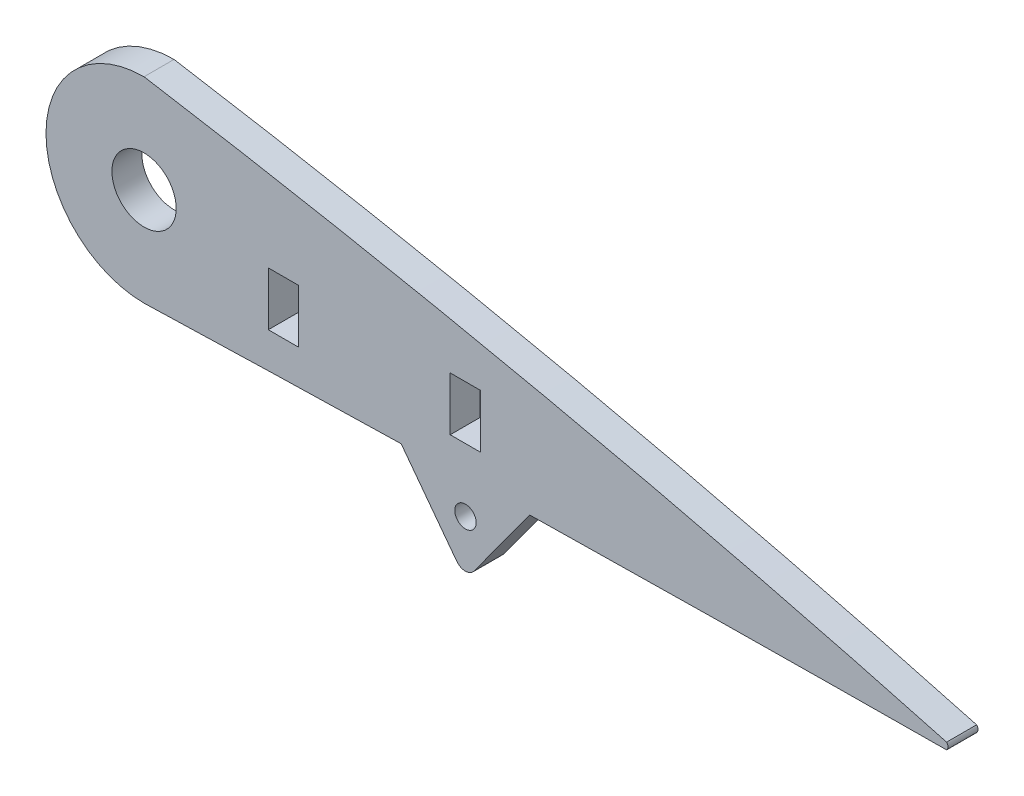
ISO-10303-21;
HEADER;
FILE_DESCRIPTION(('STEP AP214'),'2;1');
FILE_NAME('part.step','',(''),(''),'','','');
FILE_SCHEMA(('AUTOMOTIVE_DESIGN { 1 0 10303 214 1 1 1 1 }'));
ENDSEC;
DATA;
#1=APPLICATION_CONTEXT('core data for automotive mechanical design processes');
#2=APPLICATION_PROTOCOL_DEFINITION('international standard','automotive_design',2000,#1);
#3=PRODUCT_CONTEXT('',#1,'mechanical');
#4=PRODUCT('Part','Part','',(#3));
#5=PRODUCT_RELATED_PRODUCT_CATEGORY('part','',(#4));
#6=PRODUCT_DEFINITION_FORMATION('','',#4);
#7=PRODUCT_DEFINITION_CONTEXT('part definition',#1,'design');
#8=PRODUCT_DEFINITION('design','',#6,#7);
#9=PRODUCT_DEFINITION_SHAPE('','',#8);
#10=(LENGTH_UNIT() NAMED_UNIT(*) SI_UNIT(.MILLI.,.METRE.));
#11=(NAMED_UNIT(*) PLANE_ANGLE_UNIT() SI_UNIT($,.RADIAN.));
#12=(NAMED_UNIT(*) SI_UNIT($,.STERADIAN.) SOLID_ANGLE_UNIT());
#13=UNCERTAINTY_MEASURE_WITH_UNIT(LENGTH_MEASURE(1.E-05),#10,'distance_accuracy_value','');
#14=(GEOMETRIC_REPRESENTATION_CONTEXT(3) GLOBAL_UNCERTAINTY_ASSIGNED_CONTEXT((#13)) GLOBAL_UNIT_ASSIGNED_CONTEXT((#10,
#11,#12)) REPRESENTATION_CONTEXT('',''));
#15=CARTESIAN_POINT('',(0.,0.,0.));
#16=DIRECTION('',(0.,0.,1.));
#17=DIRECTION('',(1.,0.,0.));
#18=AXIS2_PLACEMENT_3D('',#15,#16,#17);
#19=CARTESIAN_POINT('',(138.143549961285,-100.777039100109,1.4));
#20=DIRECTION('',(-0.807875638847408,0.58935299452611,0.));
#21=DIRECTION('',(-0.58935299452611,-0.807875638847408,0.));
#22=AXIS2_PLACEMENT_3D('',#19,#20,#21);
#23=PLANE('',#22);
#24=DIRECTION('',(0.58935299452611,0.807875638847408,0.));
#25=VECTOR('',#24,1.);
#26=CARTESIAN_POINT('',(138.143549961285,-100.777039100109,-1.4));
#27=LINE('',#26,#25);
#28=CARTESIAN_POINT('',(205.887265796067,-7.91503921847947,-1.4));
#29=VERTEX_POINT('',#28);
#30=CARTESIAN_POINT('',(211.091334090503,-0.781385810383395,-1.4));
#31=VERTEX_POINT('',#30);
#32=EDGE_CURVE('E237',#29,#31,#27,.T.);
#33=ORIENTED_EDGE('',*,*,#32,.T.);
#34=DIRECTION('',(0.,0.,-1.));
#35=VECTOR('',#34,1.);
#36=CARTESIAN_POINT('',(211.091334090503,-0.781385810383395,1.4));
#37=LINE('',#36,#35);
#38=CARTESIAN_POINT('',(211.091334090503,-0.781385810383395,1.4));
#39=VERTEX_POINT('',#38);
#40=EDGE_CURVE('E11',#39,#31,#37,.T.);
#41=ORIENTED_EDGE('',*,*,#40,.F.);
#42=DIRECTION('',(0.58935299452611,0.807875638847408,0.));
#43=VECTOR('',#42,1.);
#44=CARTESIAN_POINT('',(138.143549961285,-100.777039100109,1.4));
#45=LINE('',#44,#43);
#46=CARTESIAN_POINT('',(205.887265796067,-7.91503921847947,1.4));
#47=VERTEX_POINT('',#46);
#48=EDGE_CURVE('E418',#47,#39,#45,.T.);
#49=ORIENTED_EDGE('',*,*,#48,.F.);
#50=DIRECTION('',(0.,0.,-1.));
#51=VECTOR('',#50,1.);
#52=CARTESIAN_POINT('',(205.887265796067,-7.91503921847947,1.4));
#53=LINE('',#52,#51);
#54=EDGE_CURVE('E279',#47,#29,#53,.T.);
#55=ORIENTED_EDGE('',*,*,#54,.T.);
#56=EDGE_LOOP('',(#33,#41,#49,#55));
#57=FACE_BOUND('',#56,.T.);
#58=ADVANCED_FACE('F41',(#57),#23,.F.);
#59=CARTESIAN_POINT('',(211.091334090503,-0.781385810385141,1.4));
#60=CARTESIAN_POINT('',(215.029550731743,-0.710611929763955,1.4));
#61=CARTESIAN_POINT('',(221.226120503685,-0.611852577215215,1.4));
#62=CARTESIAN_POINT('',(229.61763017219,-0.502926180051068,1.4));
#63=CARTESIAN_POINT('',(236.087353853958,-0.431514191746031,1.4));
#64=CARTESIAN_POINT('',(241.980776912645,-0.376520461471897,1.4));
#65=CARTESIAN_POINT('',(246.558970010783,-0.339535885925398,1.4));
#66=CARTESIAN_POINT('',(249.120490964528,-0.32127124245715,1.4));
#67=CARTESIAN_POINT('',(250.,-0.315,1.4));
#68=B_SPLINE_CURVE_WITH_KNOTS('',3,(#59,#60,#61,#62,#63,#64,#65,#66,#67),.UNSPECIFIED.,.F.,.F.,
(4,1,1,1,1,1,4),(0.846478182076588,0.893099151655267,0.919831064622048,0.945809917390178,
0.96968060086528,0.989589706283647,1.),.UNSPECIFIED.);
#69=DIRECTION('',(0.,0.,-1.));
#70=VECTOR('',#69,1.);
#71=SURFACE_OF_LINEAR_EXTRUSION('',#68,#70);
#72=CARTESIAN_POINT('',(211.091334090503,-0.781385810385141,-1.4));
#73=CARTESIAN_POINT('',(215.029550731743,-0.710611929763955,-1.4));
#74=CARTESIAN_POINT('',(221.226120503685,-0.611852577215215,-1.4));
#75=CARTESIAN_POINT('',(229.61763017219,-0.502926180051068,-1.4));
#76=CARTESIAN_POINT('',(236.087353853958,-0.431514191746031,-1.4));
#77=CARTESIAN_POINT('',(241.980776912645,-0.376520461471897,-1.4));
#78=CARTESIAN_POINT('',(246.558970010783,-0.339535885925398,-1.4));
#79=CARTESIAN_POINT('',(249.120490964528,-0.32127124245715,-1.4));
#80=CARTESIAN_POINT('',(250.,-0.315,-1.4));
#81=B_SPLINE_CURVE_WITH_KNOTS('',3,(#72,#73,#74,#75,#76,#77,#78,#79,#80),.UNSPECIFIED.,.F.,.F.,
(4,1,1,1,1,1,4),(0.846478182076588,0.893099151655267,0.919831064622048,0.945809917390178,
0.96968060086528,0.989589706283647,1.),.UNSPECIFIED.);
#82=CARTESIAN_POINT('',(250.,-0.315,-1.4));
#83=VERTEX_POINT('',#82);
#84=EDGE_CURVE('E241',#31,#83,#81,.T.);
#85=ORIENTED_EDGE('',*,*,#84,.T.);
#86=DIRECTION('',(0.,0.,-1.));
#87=VECTOR('',#86,1.);
#88=CARTESIAN_POINT('',(250.,-0.315,1.4));
#89=LINE('',#88,#87);
#90=CARTESIAN_POINT('',(250.,-0.315,1.4));
#91=VERTEX_POINT('',#90);
#92=EDGE_CURVE('E52',#91,#83,#89,.T.);
#93=ORIENTED_EDGE('',*,*,#92,.F.);
#94=EDGE_CURVE('E420',#39,#91,#68,.T.);
#95=ORIENTED_EDGE('',*,*,#94,.F.);
#96=ORIENTED_EDGE('',*,*,#40,.T.);
#97=EDGE_LOOP('',(#85,#93,#95,#96));
#98=FACE_BOUND('',#97,.T.);
#99=ADVANCED_FACE('F345',(#98),#71,.F.);
#100=CARTESIAN_POINT('',(249.685,0.,1.4));
#101=DIRECTION('',(0.,0.,-1.));
#102=DIRECTION('',(-1.,0.,0.));
#103=AXIS2_PLACEMENT_3D('',#100,#101,#102);
#104=CYLINDRICAL_SURFACE('',#103,0.445477272147512);
#105=CARTESIAN_POINT('',(249.685,0.,-1.4));
#106=DIRECTION('',(0.,0.,1.));
#107=DIRECTION('',(1.,0.,0.));
#108=AXIS2_PLACEMENT_3D('',#105,#106,#107);
#109=CIRCLE('',#108,0.445477272147512);
#110=CARTESIAN_POINT('',(250.,0.315,-1.4));
#111=VERTEX_POINT('',#110);
#112=EDGE_CURVE('E247',#111,#83,#109,.F.);
#113=ORIENTED_EDGE('',*,*,#112,.F.);
#114=DIRECTION('',(0.,0.,-1.));
#115=VECTOR('',#114,1.);
#116=CARTESIAN_POINT('',(250.,0.315,1.4));
#117=LINE('',#116,#115);
#118=CARTESIAN_POINT('',(250.,0.315,1.4));
#119=VERTEX_POINT('',#118);
#120=EDGE_CURVE('E290',#119,#111,#117,.T.);
#121=ORIENTED_EDGE('',*,*,#120,.F.);
#122=CARTESIAN_POINT('',(249.685,0.,1.4));
#123=DIRECTION('',(0.,0.,1.));
#124=DIRECTION('',(1.,0.,0.));
#125=AXIS2_PLACEMENT_3D('',#122,#123,#124);
#126=CIRCLE('',#125,0.445477272147512);
#127=EDGE_CURVE('E406',#119,#91,#126,.F.);
#128=ORIENTED_EDGE('',*,*,#127,.T.);
#129=ORIENTED_EDGE('',*,*,#92,.T.);
#130=EDGE_LOOP('',(#113,#121,#128,#129));
#131=FACE_BOUND('',#130,.T.);
#132=ADVANCED_FACE('F351',(#131),#104,.T.);
#133=CARTESIAN_POINT('',(250.,0.315,1.4));
#134=CARTESIAN_POINT('',(249.1556677398,0.545019817836279,1.4));
#135=CARTESIAN_POINT('',(246.72017569763,1.20851624251313,1.4));
#136=CARTESIAN_POINT('',(242.39133208333,2.35833905261626,1.4));
#137=CARTESIAN_POINT('',(236.8497612043,3.78762536446423,1.4));
#138=CARTESIAN_POINT('',(230.779918279366,5.29800883725429,1.4));
#139=CARTESIAN_POINT('',(224.455917947462,6.81286602762795,1.4));
#140=CARTESIAN_POINT('',(218.030543495663,8.2916106324586,1.4));
#141=CARTESIAN_POINT('',(211.562405044606,9.71973505661334,1.4));
#142=CARTESIAN_POINT('',(205.072411508973,11.0923749324442,1.4));
#143=CARTESIAN_POINT('',(198.567970912658,12.4078507263971,1.4));
#144=CARTESIAN_POINT('',(192.05236991352,13.6652979238497,1.4));
#145=CARTESIAN_POINT('',(185.527619972818,14.8640933031022,1.4));
#146=CARTESIAN_POINT('',(178.995338991115,16.0034047787228,1.4));
#147=CARTESIAN_POINT('',(172.457064741278,17.0823881152075,1.4));
#148=CARTESIAN_POINT('',(165.914317094847,18.0998278411168,1.4));
#149=CARTESIAN_POINT('',(159.368680729007,19.0545018148018,1.4));
#150=CARTESIAN_POINT('',(152.821805127969,19.9448856028229,1.4));
#151=CARTESIAN_POINT('',(146.275439401362,20.76928218283,1.4));
#152=CARTESIAN_POINT('',(139.731359791294,21.5256761133202,1.4));
#153=CARTESIAN_POINT('',(133.191836730309,22.2120042488889,1.4));
#154=CARTESIAN_POINT('',(126.658683026114,22.8257214286805,1.4));
#155=CARTESIAN_POINT('',(120.136770918309,23.363973266088,1.4));
#156=CARTESIAN_POINT('',(113.628567140501,23.8246773240715,1.4));
#157=CARTESIAN_POINT('',(107.152732037453,24.2002425936989,1.4));
#158=CARTESIAN_POINT('',(100.741095692949,24.4983995100481,1.4));
#159=CARTESIAN_POINT('',(94.4117527148801,24.6866497684384,1.4));
#160=CARTESIAN_POINT('',(88.1559179929208,24.7400956502598,1.4));
#161=CARTESIAN_POINT('',(81.9490430552625,24.658849143563,1.4));
#162=CARTESIAN_POINT('',(75.7805205915729,24.4410138083138,1.4));
#163=CARTESIAN_POINT('',(69.653692942001,24.0818848206021,1.4));
#164=CARTESIAN_POINT('',(63.5754105017725,23.5780063609574,1.4));
#165=CARTESIAN_POINT('',(57.5551895509689,22.9249466580897,1.4));
#166=CARTESIAN_POINT('',(51.6057626883655,22.1190655216041,1.4));
#167=CARTESIAN_POINT('',(45.7444003114454,21.1565644320825,1.4));
#168=CARTESIAN_POINT('',(39.9958575941734,20.035371389506,1.4));
#169=CARTESIAN_POINT('',(34.397919842374,18.756316234168,1.4));
#170=CARTESIAN_POINT('',(29.0103821035244,17.327615607561,1.4));
#171=CARTESIAN_POINT('',(23.9257984082512,15.7718649214876,1.4));
#172=CARTESIAN_POINT('',(19.2706788398757,14.1342694339559,1.4));
#173=CARTESIAN_POINT('',(15.1790983912921,12.4833354375465,1.4));
#174=CARTESIAN_POINT('',(11.7404757900967,10.8956109948061,1.4));
#175=CARTESIAN_POINT('',(8.95937186897629,9.42957736532332,1.4));
#176=CARTESIAN_POINT('',(6.76089118010329,8.10860319940964,1.4));
#177=CARTESIAN_POINT('',(5.03370974806799,6.92463805475642,1.4));
#178=CARTESIAN_POINT('',(3.67169493343308,5.85422966432144,1.4));
#179=CARTESIAN_POINT('',(2.59210112319415,4.87130536863603,1.4));
#180=CARTESIAN_POINT('',(1.73817566850273,3.95259574329487,1.4));
#181=CARTESIAN_POINT('',(1.06987082981603,3.08094637334676,1.4));
#182=CARTESIAN_POINT('',(0.571645410381898,2.24162210227498,1.4));
#183=CARTESIAN_POINT('',(0.215773898828885,1.43078539700941,1.4));
#184=CARTESIAN_POINT('',(0.102255581551055,0.88324169451159,1.4));
#185=CARTESIAN_POINT('',(0.047975,0.621425,1.4));
#186=B_SPLINE_CURVE_WITH_KNOTS('',3,(#133,#134,#135,#136,#137,#138,#139,#140,#141,#142,#143,
#144,#145,#146,#147,#148,#149,#150,#151,#152,#153,#154,#155,#156,#157,#158,#159,#160,#161,#162,
#163,#164,#165,#166,#167,#168,#169,#170,#171,#172,#173,#174,#175,#176,#177,#178,#179,#180,#181,
#182,#183,#184,#185),.UNSPECIFIED.,.F.,.F.,(4,1,1,1,1,1,1,1,1,1,1,1,1,1,1,1,1,1,1,1,1,1,1,1,1,1,
1,1,1,1,1,1,1,1,1,1,1,1,1,1,1,1,1,1,1,1,1,1,1,1,4),(0.,0.0101621996718152,0.029313053164405,
0.0520116049167946,0.0766194676467142,0.101948061207292,0.127526131749972,0.153184130655642,
0.178867887696566,0.204557902716051,0.230245711588722,0.255925967287604,0.281594302232909,
0.307246419826604,0.332878041533464,0.358484538095463,0.384061185999046,0.409602822472883,
0.435103874040524,0.460559416336008,0.485959195382529,0.511303069995141,0.53655151535457,
0.561723365940153,0.586628866723787,0.611085431247163,0.63525120042125,0.659272175841394,
0.683163753229342,0.706922144180534,0.730535909866309,0.753983199646257,0.777234690063445,
0.800246382303428,0.822950708941546,0.845237155368769,0.866915895838024,0.887662334604257,
0.906968280539555,0.924203157053238,0.938878974509372,0.95093161065299,0.960693484285195,
0.968646729467272,0.975232933115936,0.980794743901537,0.985583761312909,0.989781538836832,
0.99352131251264,0.996902112954681,1.),.UNSPECIFIED.);
#187=DIRECTION('',(0.,0.,-1.));
#188=VECTOR('',#187,1.);
#189=SURFACE_OF_LINEAR_EXTRUSION('',#186,#188);
#190=CARTESIAN_POINT('',(250.,0.315,-1.4));
#191=CARTESIAN_POINT('',(249.1556677398,0.545019817836279,-1.4));
#192=CARTESIAN_POINT('',(246.72017569763,1.20851624251313,-1.4));
#193=CARTESIAN_POINT('',(242.39133208333,2.35833905261626,-1.4));
#194=CARTESIAN_POINT('',(236.8497612043,3.78762536446423,-1.4));
#195=CARTESIAN_POINT('',(230.779918279366,5.29800883725429,-1.4));
#196=CARTESIAN_POINT('',(224.455917947462,6.81286602762795,-1.4));
#197=CARTESIAN_POINT('',(218.030543495663,8.2916106324586,-1.4));
#198=CARTESIAN_POINT('',(211.562405044606,9.71973505661334,-1.4));
#199=CARTESIAN_POINT('',(205.072411508973,11.0923749324442,-1.4));
#200=CARTESIAN_POINT('',(198.567970912658,12.4078507263971,-1.4));
#201=CARTESIAN_POINT('',(192.05236991352,13.6652979238497,-1.4));
#202=CARTESIAN_POINT('',(185.527619972818,14.8640933031022,-1.4));
#203=CARTESIAN_POINT('',(178.995338991115,16.0034047787228,-1.4));
#204=CARTESIAN_POINT('',(172.457064741278,17.0823881152075,-1.4));
#205=CARTESIAN_POINT('',(165.914317094847,18.0998278411168,-1.4));
#206=CARTESIAN_POINT('',(159.368680729007,19.0545018148018,-1.4));
#207=CARTESIAN_POINT('',(152.821805127969,19.9448856028229,-1.4));
#208=CARTESIAN_POINT('',(146.275439401362,20.76928218283,-1.4));
#209=CARTESIAN_POINT('',(139.731359791294,21.5256761133202,-1.4));
#210=CARTESIAN_POINT('',(133.191836730309,22.2120042488889,-1.4));
#211=CARTESIAN_POINT('',(126.658683026114,22.8257214286805,-1.4));
#212=CARTESIAN_POINT('',(120.136770918309,23.363973266088,-1.4));
#213=CARTESIAN_POINT('',(113.628567140501,23.8246773240715,-1.4));
#214=CARTESIAN_POINT('',(107.152732037453,24.2002425936989,-1.4));
#215=CARTESIAN_POINT('',(100.741095692949,24.4983995100481,-1.4));
#216=CARTESIAN_POINT('',(94.4117527148801,24.6866497684384,-1.4));
#217=CARTESIAN_POINT('',(88.1559179929208,24.7400956502598,-1.4));
#218=CARTESIAN_POINT('',(81.9490430552625,24.658849143563,-1.4));
#219=CARTESIAN_POINT('',(75.7805205915729,24.4410138083138,-1.4));
#220=CARTESIAN_POINT('',(69.653692942001,24.0818848206021,-1.4));
#221=CARTESIAN_POINT('',(63.5754105017725,23.5780063609574,-1.4));
#222=CARTESIAN_POINT('',(57.5551895509689,22.9249466580897,-1.4));
#223=CARTESIAN_POINT('',(51.6057626883655,22.1190655216041,-1.4));
#224=CARTESIAN_POINT('',(45.7444003114454,21.1565644320825,-1.4));
#225=CARTESIAN_POINT('',(39.9958575941734,20.035371389506,-1.4));
#226=CARTESIAN_POINT('',(34.397919842374,18.756316234168,-1.4));
#227=CARTESIAN_POINT('',(29.0103821035244,17.327615607561,-1.4));
#228=CARTESIAN_POINT('',(23.9257984082512,15.7718649214876,-1.4));
#229=CARTESIAN_POINT('',(19.2706788398757,14.1342694339559,-1.4));
#230=CARTESIAN_POINT('',(15.1790983912921,12.4833354375465,-1.4));
#231=CARTESIAN_POINT('',(11.7404757900967,10.8956109948061,-1.4));
#232=CARTESIAN_POINT('',(8.95937186897629,9.42957736532332,-1.4));
#233=CARTESIAN_POINT('',(6.76089118010329,8.10860319940964,-1.4));
#234=CARTESIAN_POINT('',(5.03370974806799,6.92463805475642,-1.4));
#235=CARTESIAN_POINT('',(3.67169493343308,5.85422966432144,-1.4));
#236=CARTESIAN_POINT('',(2.59210112319415,4.87130536863603,-1.4));
#237=CARTESIAN_POINT('',(1.73817566850273,3.95259574329487,-1.4));
#238=CARTESIAN_POINT('',(1.06987082981603,3.08094637334676,-1.4));
#239=CARTESIAN_POINT('',(0.571645410381898,2.24162210227498,-1.4));
#240=CARTESIAN_POINT('',(0.215773898828885,1.43078539700941,-1.4));
#241=CARTESIAN_POINT('',(0.102255581551055,0.88324169451159,-1.4));
#242=CARTESIAN_POINT('',(0.047975,0.621425,-1.4));
#243=B_SPLINE_CURVE_WITH_KNOTS('',3,(#190,#191,#192,#193,#194,#195,#196,#197,#198,#199,#200,
#201,#202,#203,#204,#205,#206,#207,#208,#209,#210,#211,#212,#213,#214,#215,#216,#217,#218,#219,
#220,#221,#222,#223,#224,#225,#226,#227,#228,#229,#230,#231,#232,#233,#234,#235,#236,#237,#238,
#239,#240,#241,#242),.UNSPECIFIED.,.F.,.F.,(4,1,1,1,1,1,1,1,1,1,1,1,1,1,1,1,1,1,1,1,1,1,1,1,1,1,
1,1,1,1,1,1,1,1,1,1,1,1,1,1,1,1,1,1,1,1,1,1,1,1,4),(0.,0.0101621996718152,0.029313053164405,
0.0520116049167946,0.0766194676467142,0.101948061207292,0.127526131749972,0.153184130655642,
0.178867887696566,0.204557902716051,0.230245711588722,0.255925967287604,0.281594302232909,
0.307246419826604,0.332878041533464,0.358484538095463,0.384061185999046,0.409602822472883,
0.435103874040524,0.460559416336008,0.485959195382529,0.511303069995141,0.53655151535457,
0.561723365940153,0.586628866723787,0.611085431247163,0.63525120042125,0.659272175841394,
0.683163753229342,0.706922144180534,0.730535909866309,0.753983199646257,0.777234690063445,
0.800246382303428,0.822950708941546,0.845237155368769,0.866915895838024,0.887662334604257,
0.906968280539555,0.924203157053238,0.938878974509372,0.95093161065299,0.960693484285195,
0.968646729467272,0.975232933115936,0.980794743901537,0.985583761312909,0.989781538836832,
0.99352131251264,0.996902112954681,1.),.UNSPECIFIED.);
#244=CARTESIAN_POINT('',(175.091334090503,16.6447875148628,-1.4));
#245=VERTEX_POINT('',#244);
#246=EDGE_CURVE('E254',#111,#245,#243,.T.);
#247=ORIENTED_EDGE('',*,*,#246,.T.);
#248=DIRECTION('',(0.,0.,-1.));
#249=VECTOR('',#248,1.);
#250=CARTESIAN_POINT('',(175.091334090503,16.6447875148628,1.4));
#251=LINE('',#250,#249);
#252=CARTESIAN_POINT('',(175.091334090503,16.6447875148628,1.4));
#253=VERTEX_POINT('',#252);
#254=EDGE_CURVE('E287',#253,#245,#251,.T.);
#255=ORIENTED_EDGE('',*,*,#254,.F.);
#256=EDGE_CURVE('E400',#119,#253,#186,.T.);
#257=ORIENTED_EDGE('',*,*,#256,.F.);
#258=ORIENTED_EDGE('',*,*,#120,.T.);
#259=EDGE_LOOP('',(#247,#255,#257,#258));
#260=FACE_BOUND('',#259,.T.);
#261=ADVANCED_FACE('F395',(#260),#189,.F.);
#262=CARTESIAN_POINT('',(175.091334090503,7.49391035659057,1.4));
#263=DIRECTION('',(0.,0.,-1.));
#264=DIRECTION('',(-1.,0.,0.));
#265=AXIS2_PLACEMENT_3D('',#262,#263,#264);
#266=CYLINDRICAL_SURFACE('',#265,9.15087715827226);
#267=CARTESIAN_POINT('',(175.091334090503,7.49391035659057,-1.4));
#268=DIRECTION('',(0.,0.,1.));
#269=DIRECTION('',(1.,0.,0.));
#270=AXIS2_PLACEMENT_3D('',#267,#268,#269);
#271=CIRCLE('',#270,9.15087715827226);
#272=CARTESIAN_POINT('',(175.091334090503,-1.65696680168169,-1.4));
#273=VERTEX_POINT('',#272);
#274=EDGE_CURVE('E260',#273,#245,#271,.F.);
#275=ORIENTED_EDGE('',*,*,#274,.F.);
#276=DIRECTION('',(0.,0.,-1.));
#277=VECTOR('',#276,1.);
#278=CARTESIAN_POINT('',(175.091334090503,-1.65696680168169,1.4));
#279=LINE('',#278,#277);
#280=CARTESIAN_POINT('',(175.091334090503,-1.65696680168169,1.4));
#281=VERTEX_POINT('',#280);
#282=EDGE_CURVE('E183',#281,#273,#279,.T.);
#283=ORIENTED_EDGE('',*,*,#282,.F.);
#284=CARTESIAN_POINT('',(175.091334090503,7.49391035659057,1.4));
#285=DIRECTION('',(0.,0.,1.));
#286=DIRECTION('',(1.,0.,0.));
#287=AXIS2_PLACEMENT_3D('',#284,#285,#286);
#288=CIRCLE('',#287,9.15087715827226);
#289=EDGE_CURVE('E174',#281,#253,#288,.F.);
#290=ORIENTED_EDGE('',*,*,#289,.T.);
#291=ORIENTED_EDGE('',*,*,#254,.T.);
#292=EDGE_LOOP('',(#275,#283,#290,#291));
#293=FACE_BOUND('',#292,.T.);
#294=ADVANCED_FACE('F392',(#293),#266,.T.);
#295=CARTESIAN_POINT('',(0.0479750000000421,0.621425,1.4));
#296=CARTESIAN_POINT('',(0.022713820327741,0.373490085622781,1.4));
#297=CARTESIAN_POINT('',(-0.0278207890064172,-0.122499975050795,1.4));
#298=CARTESIAN_POINT('',(0.0779912124031796,-0.88443459016519,1.4));
#299=CARTESIAN_POINT('',(0.349695650480458,-1.63883807038265,1.4));
#300=CARTESIAN_POINT('',(0.814331135147463,-2.36506892355342,1.4));
#301=CARTESIAN_POINT('',(1.4634807804219,-3.03927524464575,1.4));
#302=CARTESIAN_POINT('',(2.29097301669102,-3.66099946963281,1.4));
#303=CARTESIAN_POINT('',(3.30592875031195,-4.2357796210425,1.4));
#304=CARTESIAN_POINT('',(4.53525561919671,-4.77367414359715,1.4));
#305=CARTESIAN_POINT('',(6.02974568831346,-5.28219216458874,1.4));
#306=CARTESIAN_POINT('',(7.86898121529209,-5.76531667645051,1.4));
#307=CARTESIAN_POINT('',(10.1688313918681,-6.22171659287992,1.4));
#308=CARTESIAN_POINT('',(13.0754381889024,-6.63961873115047,1.4));
#309=CARTESIAN_POINT('',(16.7281153626735,-6.99295673763017,1.4));
#310=CARTESIAN_POINT('',(21.1899520960732,-7.24734514464806,1.4));
#311=CARTESIAN_POINT('',(26.3999844156187,-7.37663884891169,1.4));
#312=CARTESIAN_POINT('',(32.1973985639445,-7.37625691302859,1.4));
#313=CARTESIAN_POINT('',(38.3978067590692,-7.26143657975343,1.4));
#314=CARTESIAN_POINT('',(44.8576217679812,-7.05664135811482,1.4));
#315=CARTESIAN_POINT('',(51.4865430961522,-6.78645353185094,1.4));
#316=CARTESIAN_POINT('',(58.2309809321379,-6.472324586792,1.4));
#317=CARTESIAN_POINT('',(65.0520946060157,-6.13285226452229,1.4));
#318=CARTESIAN_POINT('',(71.9107727092363,-5.78400517673341,1.4));
#319=CARTESIAN_POINT('',(78.771375576202,-5.4396804536293,1.4));
#320=CARTESIAN_POINT('',(85.6104986098069,-5.11095125256302,1.4));
#321=CARTESIAN_POINT('',(92.4321075899319,-4.80495332572016,1.4));
#322=CARTESIAN_POINT('',(99.2550311901161,-4.53198165482286,1.4));
#323=CARTESIAN_POINT('',(106.097378404908,-4.27827467093654,1.4));
#324=CARTESIAN_POINT('',(112.969211680251,-4.00308992591576,1.4));
#325=CARTESIAN_POINT('',(119.864404254546,-3.7231761842266,1.4));
#326=CARTESIAN_POINT('',(126.77386047349,-3.44006729637194,1.4));
#327=CARTESIAN_POINT('',(133.681563213166,-3.15869560039856,1.4));
#328=CARTESIAN_POINT('',(140.581870407103,-2.88238072038557,1.4));
#329=CARTESIAN_POINT('',(147.472013761628,-2.61392295823053,1.4));
#330=CARTESIAN_POINT('',(154.352602410647,-2.35562641478931,1.4));
#331=CARTESIAN_POINT('',(161.225044134143,-2.10936992101264,1.4));
#332=CARTESIAN_POINT('',(168.090869746122,-1.87663407423007,1.4));
#333=CARTESIAN_POINT('',(174.951578521954,-1.65864310394776,1.4));
#334=CARTESIAN_POINT('',(181.808595965616,-1.45637812296637,1.4));
#335=CARTESIAN_POINT('',(188.663234462377,-1.27038337713602,1.4));
#336=CARTESIAN_POINT('',(194.423908611312,-1.12810208165502,1.4));
#337=CARTESIAN_POINT('',(197.899847219277,-1.04871934980089,1.4));
#338=CARTESIAN_POINT('',(199.091334090503,-1.0222676899704,1.4));
#339=B_SPLINE_CURVE_WITH_KNOTS('',3,(#295,#296,#297,#298,#299,#300,#301,#302,#303,#304,#305,
#306,#307,#308,#309,#310,#311,#312,#313,#314,#315,#316,#317,#318,#319,#320,#321,#322,#323,#324,
#325,#326,#327,#328,#329,#330,#331,#332,#333,#334,#335,#336,#337,#338),.UNSPECIFIED.,.F.,.F.,(4,
1,1,1,1,1,1,1,1,1,1,1,1,1,1,1,1,1,1,1,1,1,1,1,1,1,1,1,1,1,1,1,1,1,1,1,1,1,1,1,1,4),(0.,
0.00294144629716841,0.00588431899986843,0.00901612990907169,0.0123645467308032,
0.0160079338878462,0.0200368451305784,0.0245737277973679,0.029783834741521,0.0358970100073663,
0.043240439578336,0.0522759653413005,0.0636345893302709,0.0779831757705632,0.0956981612833506,
0.116520086015495,0.139660730330278,0.164312170171254,0.189918890388145,0.216157201054431,
0.242837761985605,0.269833582781319,0.296993021546457,0.324123271890544,0.351139106824528,
0.378035508721976,0.404946015910257,0.431960836658272,0.459078394602815,0.486347400324305,
0.513640830241323,0.540928594677757,0.568176028038828,0.595379568955062,0.622543444942076,
0.6496732603013,0.676775201241309,0.70385522836994,0.730918774891245,0.757971338224895,
0.785017763038357,0.799123890261102),.UNSPECIFIED.);
#340=DIRECTION('',(0.,0.,-1.));
#341=VECTOR('',#340,1.);
#342=SURFACE_OF_LINEAR_EXTRUSION('',#339,#341);
#343=CARTESIAN_POINT('',(0.0479750000000421,0.621425,-1.4));
#344=CARTESIAN_POINT('',(0.022713820327741,0.373490085622781,-1.4));
#345=CARTESIAN_POINT('',(-0.0278207890064172,-0.122499975050795,-1.4));
#346=CARTESIAN_POINT('',(0.0779912124031796,-0.88443459016519,-1.4));
#347=CARTESIAN_POINT('',(0.349695650480458,-1.63883807038265,-1.4));
#348=CARTESIAN_POINT('',(0.814331135147463,-2.36506892355342,-1.4));
#349=CARTESIAN_POINT('',(1.4634807804219,-3.03927524464575,-1.4));
#350=CARTESIAN_POINT('',(2.29097301669102,-3.66099946963281,-1.4));
#351=CARTESIAN_POINT('',(3.30592875031195,-4.2357796210425,-1.4));
#352=CARTESIAN_POINT('',(4.53525561919671,-4.77367414359715,-1.4));
#353=CARTESIAN_POINT('',(6.02974568831346,-5.28219216458874,-1.4));
#354=CARTESIAN_POINT('',(7.86898121529209,-5.76531667645051,-1.4));
#355=CARTESIAN_POINT('',(10.1688313918681,-6.22171659287992,-1.4));
#356=CARTESIAN_POINT('',(13.0754381889024,-6.63961873115047,-1.4));
#357=CARTESIAN_POINT('',(16.7281153626735,-6.99295673763017,-1.4));
#358=CARTESIAN_POINT('',(21.1899520960732,-7.24734514464806,-1.4));
#359=CARTESIAN_POINT('',(26.3999844156187,-7.37663884891169,-1.4));
#360=CARTESIAN_POINT('',(32.1973985639445,-7.37625691302859,-1.4));
#361=CARTESIAN_POINT('',(38.3978067590692,-7.26143657975343,-1.4));
#362=CARTESIAN_POINT('',(44.8576217679812,-7.05664135811482,-1.4));
#363=CARTESIAN_POINT('',(51.4865430961522,-6.78645353185094,-1.4));
#364=CARTESIAN_POINT('',(58.2309809321379,-6.472324586792,-1.4));
#365=CARTESIAN_POINT('',(65.0520946060157,-6.13285226452229,-1.4));
#366=CARTESIAN_POINT('',(71.9107727092363,-5.78400517673341,-1.4));
#367=CARTESIAN_POINT('',(78.771375576202,-5.4396804536293,-1.4));
#368=CARTESIAN_POINT('',(85.6104986098069,-5.11095125256302,-1.4));
#369=CARTESIAN_POINT('',(92.4321075899319,-4.80495332572016,-1.4));
#370=CARTESIAN_POINT('',(99.2550311901161,-4.53198165482286,-1.4));
#371=CARTESIAN_POINT('',(106.097378404908,-4.27827467093654,-1.4));
#372=CARTESIAN_POINT('',(112.969211680251,-4.00308992591576,-1.4));
#373=CARTESIAN_POINT('',(119.864404254546,-3.7231761842266,-1.4));
#374=CARTESIAN_POINT('',(126.77386047349,-3.44006729637194,-1.4));
#375=CARTESIAN_POINT('',(133.681563213166,-3.15869560039856,-1.4));
#376=CARTESIAN_POINT('',(140.581870407103,-2.88238072038557,-1.4));
#377=CARTESIAN_POINT('',(147.472013761628,-2.61392295823053,-1.4));
#378=CARTESIAN_POINT('',(154.352602410647,-2.35562641478931,-1.4));
#379=CARTESIAN_POINT('',(161.225044134143,-2.10936992101264,-1.4));
#380=CARTESIAN_POINT('',(168.090869746122,-1.87663407423007,-1.4));
#381=CARTESIAN_POINT('',(174.951578521954,-1.65864310394776,-1.4));
#382=CARTESIAN_POINT('',(181.808595965616,-1.45637812296637,-1.4));
#383=CARTESIAN_POINT('',(188.663234462377,-1.27038337713602,-1.4));
#384=CARTESIAN_POINT('',(194.423908611312,-1.12810208165502,-1.4));
#385=CARTESIAN_POINT('',(197.899847219277,-1.04871934980089,-1.4));
#386=CARTESIAN_POINT('',(199.091334090503,-1.0222676899704,-1.4));
#387=B_SPLINE_CURVE_WITH_KNOTS('',3,(#343,#344,#345,#346,#347,#348,#349,#350,#351,#352,#353,
#354,#355,#356,#357,#358,#359,#360,#361,#362,#363,#364,#365,#366,#367,#368,#369,#370,#371,#372,
#373,#374,#375,#376,#377,#378,#379,#380,#381,#382,#383,#384,#385,#386),.UNSPECIFIED.,.F.,.F.,(4,
1,1,1,1,1,1,1,1,1,1,1,1,1,1,1,1,1,1,1,1,1,1,1,1,1,1,1,1,1,1,1,1,1,1,1,1,1,1,1,1,4),(0.,
0.00294144629716841,0.00588431899986843,0.00901612990907169,0.0123645467308032,
0.0160079338878462,0.0200368451305784,0.0245737277973679,0.029783834741521,0.0358970100073663,
0.043240439578336,0.0522759653413005,0.0636345893302709,0.0779831757705632,0.0956981612833506,
0.116520086015495,0.139660730330278,0.164312170171254,0.189918890388145,0.216157201054431,
0.242837761985605,0.269833582781319,0.296993021546457,0.324123271890544,0.351139106824528,
0.378035508721976,0.404946015910257,0.431960836658272,0.459078394602815,0.486347400324305,
0.513640830241323,0.540928594677757,0.568176028038828,0.595379568955062,0.622543444942076,
0.6496732603013,0.676775201241309,0.70385522836994,0.730918774891245,0.757971338224895,
0.785017763038357,0.799123890261102),.UNSPECIFIED.);
#388=CARTESIAN_POINT('',(199.091334090503,-1.02226768997041,-1.4));
#389=VERTEX_POINT('',#388);
#390=EDGE_CURVE('E181',#273,#389,#387,.T.);
#391=ORIENTED_EDGE('',*,*,#390,.T.);
#392=DIRECTION('',(0.,0.,-1.));
#393=VECTOR('',#392,1.);
#394=CARTESIAN_POINT('',(199.091334090503,-1.02226768997041,1.4));
#395=LINE('',#394,#393);
#396=CARTESIAN_POINT('',(199.091334090503,-1.02226768997041,1.4));
#397=VERTEX_POINT('',#396);
#398=EDGE_CURVE('E178',#397,#389,#395,.T.);
#399=ORIENTED_EDGE('',*,*,#398,.F.);
#400=EDGE_CURVE('E168',#281,#397,#339,.T.);
#401=ORIENTED_EDGE('',*,*,#400,.F.);
#402=ORIENTED_EDGE('',*,*,#282,.T.);
#403=EDGE_LOOP('',(#391,#399,#401,#402));
#404=FACE_BOUND('',#403,.T.);
#405=ADVANCED_FACE('F179',(#404),#342,.F.);
#406=CARTESIAN_POINT('',(126.741670789131,95.2488706749312,1.4));
#407=DIRECTION('',(0.799416457975105,0.600777268809778,0.));
#408=DIRECTION('',(-0.600777268809778,0.799416457975105,0.));
#409=AXIS2_PLACEMENT_3D('',#406,#407,#408);
#410=PLANE('',#409);
#411=DIRECTION('',(0.600777268809778,-0.799416457975105,0.));
#412=VECTOR('',#411,1.);
#413=CARTESIAN_POINT('',(126.741670789131,95.2488706749312,-1.4));
#414=LINE('',#413,#412);
#415=CARTESIAN_POINT('',(204.279973699244,-7.92646349276303,-1.4));
#416=VERTEX_POINT('',#415);
#417=EDGE_CURVE('E114',#389,#416,#414,.T.);
#418=ORIENTED_EDGE('',*,*,#417,.T.);
#419=DIRECTION('',(0.,0.,-1.));
#420=VECTOR('',#419,1.);
#421=CARTESIAN_POINT('',(204.279973699244,-7.92646349276303,1.4));
#422=LINE('',#421,#420);
#423=CARTESIAN_POINT('',(204.279973699244,-7.92646349276303,1.4));
#424=VERTEX_POINT('',#423);
#425=EDGE_CURVE('E184',#424,#416,#422,.T.);
#426=ORIENTED_EDGE('',*,*,#425,.F.);
#427=DIRECTION('',(0.600777268809778,-0.799416457975105,0.));
#428=VECTOR('',#427,1.);
#429=CARTESIAN_POINT('',(126.741670789131,95.2488706749312,1.4));
#430=LINE('',#429,#428);
#431=EDGE_CURVE('E172',#397,#424,#430,.T.);
#432=ORIENTED_EDGE('',*,*,#431,.F.);
#433=ORIENTED_EDGE('',*,*,#398,.T.);
#434=EDGE_LOOP('',(#418,#426,#432,#433));
#435=FACE_BOUND('',#434,.T.);
#436=ADVANCED_FACE('F186',(#435),#410,.F.);
#437=CARTESIAN_POINT('',(189.491334090503,0.,1.4));
#438=DIRECTION('',(-1.,0.,0.));
#439=DIRECTION('',(0.,0.,1.));
#440=AXIS2_PLACEMENT_3D('',#437,#438,#439);
#441=PLANE('',#440);
#442=DIRECTION('',(0.,1.,0.));
#443=VECTOR('',#442,1.);
#444=CARTESIAN_POINT('',(189.491334090503,0.,-1.4));
#445=LINE('',#444,#443);
#446=CARTESIAN_POINT('',(189.491334090503,1.99391035659056,-1.4));
#447=VERTEX_POINT('',#446);
#448=CARTESIAN_POINT('',(189.491334090503,6.99391035659056,-1.4));
#449=VERTEX_POINT('',#448);
#450=EDGE_CURVE('E213',#447,#449,#445,.T.);
#451=ORIENTED_EDGE('',*,*,#450,.F.);
#452=DIRECTION('',(0.,0.,-1.));
#453=VECTOR('',#452,1.);
#454=CARTESIAN_POINT('',(189.491334090503,1.99391035659056,1.4));
#455=LINE('',#454,#453);
#456=CARTESIAN_POINT('',(189.491334090503,1.99391035659056,1.4));
#457=VERTEX_POINT('',#456);
#458=EDGE_CURVE('E282',#457,#447,#455,.T.);
#459=ORIENTED_EDGE('',*,*,#458,.F.);
#460=DIRECTION('',(0.,1.,0.));
#461=VECTOR('',#460,1.);
#462=CARTESIAN_POINT('',(189.491334090503,0.,1.4));
#463=LINE('',#462,#461);
#464=CARTESIAN_POINT('',(189.491334090503,6.99391035659056,1.4));
#465=VERTEX_POINT('',#464);
#466=EDGE_CURVE('E449',#457,#465,#463,.T.);
#467=ORIENTED_EDGE('',*,*,#466,.T.);
#468=DIRECTION('',(0.,0.,-1.));
#469=VECTOR('',#468,1.);
#470=CARTESIAN_POINT('',(189.491334090503,6.99391035659056,1.4));
#471=LINE('',#470,#469);
#472=EDGE_CURVE('E295',#465,#449,#471,.T.);
#473=ORIENTED_EDGE('',*,*,#472,.T.);
#474=EDGE_LOOP('',(#451,#459,#467,#473));
#475=FACE_BOUND('',#474,.T.);
#476=ADVANCED_FACE('F371',(#475),#441,.T.);
#477=CARTESIAN_POINT('',(0.,1.99391035659056,1.4));
#478=DIRECTION('',(0.,1.,0.));
#479=DIRECTION('',(0.,0.,1.));
#480=AXIS2_PLACEMENT_3D('',#477,#478,#479);
#481=PLANE('',#480);
#482=DIRECTION('',(1.,0.,0.));
#483=VECTOR('',#482,1.);
#484=CARTESIAN_POINT('',(0.,1.99391035659056,-1.4));
#485=LINE('',#484,#483);
#486=CARTESIAN_POINT('',(186.691334090503,1.99391035659056,-1.4));
#487=VERTEX_POINT('',#486);
#488=EDGE_CURVE('E217',#487,#447,#485,.T.);
#489=ORIENTED_EDGE('',*,*,#488,.F.);
#490=DIRECTION('',(0.,0.,-1.));
#491=VECTOR('',#490,1.);
#492=CARTESIAN_POINT('',(186.691334090503,1.99391035659056,1.4));
#493=LINE('',#492,#491);
#494=CARTESIAN_POINT('',(186.691334090503,1.99391035659056,1.4));
#495=VERTEX_POINT('',#494);
#496=EDGE_CURVE('E302',#495,#487,#493,.T.);
#497=ORIENTED_EDGE('',*,*,#496,.F.);
#498=DIRECTION('',(1.,0.,0.));
#499=VECTOR('',#498,1.);
#500=CARTESIAN_POINT('',(0.,1.99391035659056,1.4));
#501=LINE('',#500,#499);
#502=EDGE_CURVE('E445',#495,#457,#501,.T.);
#503=ORIENTED_EDGE('',*,*,#502,.T.);
#504=ORIENTED_EDGE('',*,*,#458,.T.);
#505=EDGE_LOOP('',(#489,#497,#503,#504));
#506=FACE_BOUND('',#505,.T.);
#507=ADVANCED_FACE('F367',(#506),#481,.T.);
#508=CARTESIAN_POINT('',(186.691334090503,0.,1.4));
#509=DIRECTION('',(-1.,0.,0.));
#510=DIRECTION('',(0.,0.,1.));
#511=AXIS2_PLACEMENT_3D('',#508,#509,#510);
#512=PLANE('',#511);
#513=DIRECTION('',(0.,1.,0.));
#514=VECTOR('',#513,1.);
#515=CARTESIAN_POINT('',(186.691334090503,0.,-1.4));
#516=LINE('',#515,#514);
#517=CARTESIAN_POINT('',(186.691334090503,6.99391035659056,-1.4));
#518=VERTEX_POINT('',#517);
#519=EDGE_CURVE('E221',#487,#518,#516,.T.);
#520=ORIENTED_EDGE('',*,*,#519,.T.);
#521=DIRECTION('',(0.,0.,-1.));
#522=VECTOR('',#521,1.);
#523=CARTESIAN_POINT('',(186.691334090503,6.99391035659056,1.4));
#524=LINE('',#523,#522);
#525=CARTESIAN_POINT('',(186.691334090503,6.99391035659056,1.4));
#526=VERTEX_POINT('',#525);
#527=EDGE_CURVE('E298',#526,#518,#524,.T.);
#528=ORIENTED_EDGE('',*,*,#527,.F.);
#529=DIRECTION('',(0.,1.,0.));
#530=VECTOR('',#529,1.);
#531=CARTESIAN_POINT('',(186.691334090503,0.,1.4));
#532=LINE('',#531,#530);
#533=EDGE_CURVE('E441',#495,#526,#532,.T.);
#534=ORIENTED_EDGE('',*,*,#533,.F.);
#535=ORIENTED_EDGE('',*,*,#496,.T.);
#536=EDGE_LOOP('',(#520,#528,#534,#535));
#537=FACE_BOUND('',#536,.T.);
#538=ADVANCED_FACE('F364',(#537),#512,.F.);
#539=CARTESIAN_POINT('',(0.,6.99391035659057,1.4));
#540=DIRECTION('',(0.,1.,0.));
#541=DIRECTION('',(0.,0.,1.));
#542=AXIS2_PLACEMENT_3D('',#539,#540,#541);
#543=PLANE('',#542);
#544=DIRECTION('',(1.,0.,0.));
#545=VECTOR('',#544,1.);
#546=CARTESIAN_POINT('',(0.,6.99391035659057,-1.4));
#547=LINE('',#546,#545);
#548=CARTESIAN_POINT('',(203.666334090503,6.99391035659057,-1.4));
#549=VERTEX_POINT('',#548);
#550=CARTESIAN_POINT('',(206.516334090503,6.99391035659057,-1.4));
#551=VERTEX_POINT('',#550);
#552=EDGE_CURVE('E197',#549,#551,#547,.T.);
#553=ORIENTED_EDGE('',*,*,#552,.T.);
#554=DIRECTION('',(0.,0.,-1.));
#555=VECTOR('',#554,1.);
#556=CARTESIAN_POINT('',(206.516334090503,6.99391035659057,1.4));
#557=LINE('',#556,#555);
#558=CARTESIAN_POINT('',(206.516334090503,6.99391035659057,1.4));
#559=VERTEX_POINT('',#558);
#560=EDGE_CURVE('E45',#559,#551,#557,.T.);
#561=ORIENTED_EDGE('',*,*,#560,.F.);
#562=DIRECTION('',(1.,0.,0.));
#563=VECTOR('',#562,1.);
#564=CARTESIAN_POINT('',(0.,6.99391035659057,1.4));
#565=LINE('',#564,#563);
#566=CARTESIAN_POINT('',(203.666334090503,6.99391035659057,1.4));
#567=VERTEX_POINT('',#566);
#568=EDGE_CURVE('E278',#567,#559,#565,.T.);
#569=ORIENTED_EDGE('',*,*,#568,.F.);
#570=DIRECTION('',(0.,0.,-1.));
#571=VECTOR('',#570,1.);
#572=CARTESIAN_POINT('',(203.666334090503,6.99391035659057,1.4));
#573=LINE('',#572,#571);
#574=EDGE_CURVE('E190',#567,#549,#573,.T.);
#575=ORIENTED_EDGE('',*,*,#574,.T.);
#576=EDGE_LOOP('',(#553,#561,#569,#575));
#577=FACE_BOUND('',#576,.T.);
#578=ADVANCED_FACE('F43',(#577),#543,.F.);
#579=CARTESIAN_POINT('',(206.516334090503,0.,1.4));
#580=DIRECTION('',(1.,0.,0.));
#581=DIRECTION('',(0.,0.,-1.));
#582=AXIS2_PLACEMENT_3D('',#579,#580,#581);
#583=PLANE('',#582);
#584=DIRECTION('',(0.,-1.,0.));
#585=VECTOR('',#584,1.);
#586=CARTESIAN_POINT('',(206.516334090503,0.,-1.4));
#587=LINE('',#586,#585);
#588=CARTESIAN_POINT('',(206.516334090503,1.99391035659057,-1.4));
#589=VERTEX_POINT('',#588);
#590=EDGE_CURVE('E201',#551,#589,#587,.T.);
#591=ORIENTED_EDGE('',*,*,#590,.T.);
#592=DIRECTION('',(0.,0.,-1.));
#593=VECTOR('',#592,1.);
#594=CARTESIAN_POINT('',(206.516334090503,1.99391035659057,1.4));
#595=LINE('',#594,#593);
#596=CARTESIAN_POINT('',(206.516334090503,1.99391035659057,1.4));
#597=VERTEX_POINT('',#596);
#598=EDGE_CURVE('E311',#597,#589,#595,.T.);
#599=ORIENTED_EDGE('',*,*,#598,.F.);
#600=DIRECTION('',(0.,-1.,0.));
#601=VECTOR('',#600,1.);
#602=CARTESIAN_POINT('',(206.516334090503,0.,1.4));
#603=LINE('',#602,#601);
#604=EDGE_CURVE('E129',#559,#597,#603,.T.);
#605=ORIENTED_EDGE('',*,*,#604,.F.);
#606=ORIENTED_EDGE('',*,*,#560,.T.);
#607=EDGE_LOOP('',(#591,#599,#605,#606));
#608=FACE_BOUND('',#607,.T.);
#609=ADVANCED_FACE('F318',(#608),#583,.F.);
#610=CARTESIAN_POINT('',(0.,1.9939103565906,1.4));
#611=DIRECTION('',(0.,1.,0.));
#612=DIRECTION('',(-1.,0.,0.));
#613=AXIS2_PLACEMENT_3D('',#610,#611,#612);
#614=PLANE('',#613);
#615=DIRECTION('',(1.,0.,0.));
#616=VECTOR('',#615,1.);
#617=CARTESIAN_POINT('',(0.,1.9939103565906,-1.4));
#618=LINE('',#617,#616);
#619=CARTESIAN_POINT('',(203.666334090503,1.99391035659057,-1.4));
#620=VERTEX_POINT('',#619);
#621=EDGE_CURVE('E205',#620,#589,#618,.T.);
#622=ORIENTED_EDGE('',*,*,#621,.F.);
#623=DIRECTION('',(0.,0.,-1.));
#624=VECTOR('',#623,1.);
#625=CARTESIAN_POINT('',(203.666334090503,1.99391035659057,1.4));
#626=LINE('',#625,#624);
#627=CARTESIAN_POINT('',(203.666334090503,1.99391035659057,1.4));
#628=VERTEX_POINT('',#627);
#629=EDGE_CURVE('E309',#628,#620,#626,.T.);
#630=ORIENTED_EDGE('',*,*,#629,.F.);
#631=DIRECTION('',(1.,0.,0.));
#632=VECTOR('',#631,1.);
#633=CARTESIAN_POINT('',(0.,1.9939103565906,1.4));
#634=LINE('',#633,#632);
#635=EDGE_CURVE('E455',#628,#597,#634,.T.);
#636=ORIENTED_EDGE('',*,*,#635,.T.);
#637=ORIENTED_EDGE('',*,*,#598,.T.);
#638=EDGE_LOOP('',(#622,#630,#636,#637));
#639=FACE_BOUND('',#638,.T.);
#640=ADVANCED_FACE('F332',(#639),#614,.T.);
#641=CARTESIAN_POINT('',(205.091334090503,-3.90608964340943,1.4));
#642=DIRECTION('',(0.,0.,-1.));
#643=DIRECTION('',(-1.,0.,0.));
#644=AXIS2_PLACEMENT_3D('',#641,#642,#643);
#645=CYLINDRICAL_SURFACE('',#644,0.999999999999998);
#646=CARTESIAN_POINT('',(205.091334090503,-3.90608964340943,1.4));
#647=DIRECTION('',(0.,0.,1.));
#648=DIRECTION('',(1.,0.,0.));
#649=AXIS2_PLACEMENT_3D('',#646,#647,#648);
#650=CIRCLE('',#649,0.999999999999998);
#651=CARTESIAN_POINT('',(206.091334090503,-3.90608964340943,1.4));
#652=VERTEX_POINT('',#651);
#653=EDGE_CURVE('E421',#652,#652,#650,.T.);
#654=ORIENTED_EDGE('',*,*,#653,.T.);
#655=EDGE_LOOP('',(#654));
#656=FACE_BOUND('',#655,.T.);
#657=CARTESIAN_POINT('',(205.091334090503,-3.90608964340943,-1.4));
#658=DIRECTION('',(0.,0.,1.));
#659=DIRECTION('',(1.,0.,0.));
#660=AXIS2_PLACEMENT_3D('',#657,#658,#659);
#661=CIRCLE('',#660,0.999999999999998);
#662=CARTESIAN_POINT('',(206.091334090503,-3.90608964340943,-1.4));
#663=VERTEX_POINT('',#662);
#664=EDGE_CURVE('E233',#663,#663,#661,.T.);
#665=ORIENTED_EDGE('',*,*,#664,.F.);
#666=EDGE_LOOP('',(#665));
#667=FACE_BOUND('',#666,.T.);
#668=ADVANCED_FACE('F334',(#656,#667),#645,.F.);
#669=CARTESIAN_POINT('',(175.091334090503,7.49391035659057,1.4));
#670=DIRECTION('',(0.,0.,-1.));
#671=DIRECTION('',(-1.,0.,0.));
#672=AXIS2_PLACEMENT_3D('',#669,#670,#671);
#673=CYLINDRICAL_SURFACE('',#672,2.99999999999999);
#674=CARTESIAN_POINT('',(175.091334090503,7.49391035659057,1.4));
#675=DIRECTION('',(0.,0.,1.));
#676=DIRECTION('',(1.,0.,0.));
#677=AXIS2_PLACEMENT_3D('',#674,#675,#676);
#678=CIRCLE('',#677,2.99999999999999);
#679=CARTESIAN_POINT('',(178.091334090503,7.49391035659057,1.4));
#680=VERTEX_POINT('',#679);
#681=EDGE_CURVE('E426',#680,#680,#678,.T.);
#682=ORIENTED_EDGE('',*,*,#681,.T.);
#683=EDGE_LOOP('',(#682));
#684=FACE_BOUND('',#683,.T.);
#685=CARTESIAN_POINT('',(175.091334090503,7.49391035659057,-1.4));
#686=DIRECTION('',(0.,0.,1.));
#687=DIRECTION('',(1.,0.,0.));
#688=AXIS2_PLACEMENT_3D('',#685,#686,#687);
#689=CIRCLE('',#688,2.99999999999999);
#690=CARTESIAN_POINT('',(178.091334090503,7.49391035659057,-1.4));
#691=VERTEX_POINT('',#690);
#692=EDGE_CURVE('E229',#691,#691,#689,.T.);
#693=ORIENTED_EDGE('',*,*,#692,.F.);
#694=EDGE_LOOP('',(#693));
#695=FACE_BOUND('',#694,.T.);
#696=ADVANCED_FACE('F340',(#684,#695),#673,.F.);
#697=CARTESIAN_POINT('',(0.,6.99391035659056,1.4));
#698=DIRECTION('',(0.,1.,0.));
#699=DIRECTION('',(0.,0.,1.));
#700=AXIS2_PLACEMENT_3D('',#697,#698,#699);
#701=PLANE('',#700);
#702=DIRECTION('',(1.,0.,0.));
#703=VECTOR('',#702,1.);
#704=CARTESIAN_POINT('',(0.,6.99391035659056,-1.4));
#705=LINE('',#704,#703);
#706=EDGE_CURVE('E225',#518,#449,#705,.T.);
#707=ORIENTED_EDGE('',*,*,#706,.T.);
#708=ORIENTED_EDGE('',*,*,#472,.F.);
#709=DIRECTION('',(1.,0.,0.));
#710=VECTOR('',#709,1.);
#711=CARTESIAN_POINT('',(0.,6.99391035659056,1.4));
#712=LINE('',#711,#710);
#713=EDGE_CURVE('E438',#526,#465,#712,.T.);
#714=ORIENTED_EDGE('',*,*,#713,.F.);
#715=ORIENTED_EDGE('',*,*,#527,.T.);
#716=EDGE_LOOP('',(#707,#708,#714,#715));
#717=FACE_BOUND('',#716,.T.);
#718=ADVANCED_FACE('F359',(#717),#701,.F.);
#719=CARTESIAN_POINT('',(203.666334090503,0.,1.4));
#720=DIRECTION('',(1.,0.,0.));
#721=DIRECTION('',(0.,0.,-1.));
#722=AXIS2_PLACEMENT_3D('',#719,#720,#721);
#723=PLANE('',#722);
#724=DIRECTION('',(0.,-1.,0.));
#725=VECTOR('',#724,1.);
#726=CARTESIAN_POINT('',(203.666334090503,0.,-1.4));
#727=LINE('',#726,#725);
#728=EDGE_CURVE('E209',#549,#620,#727,.T.);
#729=ORIENTED_EDGE('',*,*,#728,.F.);
#730=ORIENTED_EDGE('',*,*,#574,.F.);
#731=DIRECTION('',(0.,-1.,0.));
#732=VECTOR('',#731,1.);
#733=CARTESIAN_POINT('',(203.666334090503,0.,1.4));
#734=LINE('',#733,#732);
#735=EDGE_CURVE('E330',#567,#628,#734,.T.);
#736=ORIENTED_EDGE('',*,*,#735,.T.);
#737=ORIENTED_EDGE('',*,*,#629,.T.);
#738=EDGE_LOOP('',(#729,#730,#736,#737));
#739=FACE_BOUND('',#738,.T.);
#740=ADVANCED_FACE('F327',(#739),#723,.T.);
#741=CARTESIAN_POINT('',(205.07939015722,-7.32568622395327,1.4));
#742=DIRECTION('',(0.,0.,-1.));
#743=DIRECTION('',(-1.,0.,0.));
#744=AXIS2_PLACEMENT_3D('',#741,#742,#743);
#745=CYLINDRICAL_SURFACE('',#744,0.999999999999993);
#746=CARTESIAN_POINT('',(205.07939015722,-7.32568622395327,-1.4));
#747=DIRECTION('',(0.,0.,1.));
#748=DIRECTION('',(1.,0.,0.));
#749=AXIS2_PLACEMENT_3D('',#746,#747,#748);
#750=CIRCLE('',#749,0.999999999999993);
#751=EDGE_CURVE('E120',#416,#29,#750,.T.);
#752=ORIENTED_EDGE('',*,*,#751,.T.);
#753=ORIENTED_EDGE('',*,*,#54,.F.);
#754=CARTESIAN_POINT('',(205.07939015722,-7.32568622395327,1.4));
#755=DIRECTION('',(0.,0.,1.));
#756=DIRECTION('',(1.,0.,0.));
#757=AXIS2_PLACEMENT_3D('',#754,#755,#756);
#758=CIRCLE('',#757,0.999999999999993);
#759=EDGE_CURVE('E61',#424,#47,#758,.T.);
#760=ORIENTED_EDGE('',*,*,#759,.F.);
#761=ORIENTED_EDGE('',*,*,#425,.T.);
#762=EDGE_LOOP('',(#752,#753,#760,#761));
#763=FACE_BOUND('',#762,.T.);
#764=ADVANCED_FACE('F376',(#763),#745,.T.);
#765=CARTESIAN_POINT('',(0.,0.,1.4));
#766=DIRECTION('',(0.,0.,1.));
#767=DIRECTION('',(1.,0.,0.));
#768=AXIS2_PLACEMENT_3D('',#765,#766,#767);
#769=PLANE('',#768);
#770=ORIENTED_EDGE('',*,*,#568,.T.);
#771=ORIENTED_EDGE('',*,*,#604,.T.);
#772=ORIENTED_EDGE('',*,*,#635,.F.);
#773=ORIENTED_EDGE('',*,*,#735,.F.);
#774=EDGE_LOOP('',(#770,#771,#772,#773));
#775=FACE_BOUND('',#774,.T.);
#776=ORIENTED_EDGE('',*,*,#466,.F.);
#777=ORIENTED_EDGE('',*,*,#502,.F.);
#778=ORIENTED_EDGE('',*,*,#533,.T.);
#779=ORIENTED_EDGE('',*,*,#713,.T.);
#780=EDGE_LOOP('',(#776,#777,#778,#779));
#781=FACE_BOUND('',#780,.T.);
#782=ORIENTED_EDGE('',*,*,#681,.F.);
#783=EDGE_LOOP('',(#782));
#784=FACE_BOUND('',#783,.T.);
#785=ORIENTED_EDGE('',*,*,#653,.F.);
#786=EDGE_LOOP('',(#785));
#787=FACE_BOUND('',#786,.T.);
#788=ORIENTED_EDGE('',*,*,#48,.T.);
#789=ORIENTED_EDGE('',*,*,#94,.T.);
#790=ORIENTED_EDGE('',*,*,#127,.F.);
#791=ORIENTED_EDGE('',*,*,#256,.T.);
#792=ORIENTED_EDGE('',*,*,#289,.F.);
#793=ORIENTED_EDGE('',*,*,#400,.T.);
#794=ORIENTED_EDGE('',*,*,#431,.T.);
#795=ORIENTED_EDGE('',*,*,#759,.T.);
#796=EDGE_LOOP('',(#788,#789,#790,#791,#792,#793,#794,#795));
#797=FACE_BOUND('',#796,.T.);
#798=ADVANCED_FACE('F170',(#775,#781,#784,#787,#797),#769,.T.);
#799=CARTESIAN_POINT('',(0.,0.,-1.4));
#800=DIRECTION('',(0.,0.,1.));
#801=DIRECTION('',(1.,0.,0.));
#802=AXIS2_PLACEMENT_3D('',#799,#800,#801);
#803=PLANE('',#802);
#804=ORIENTED_EDGE('',*,*,#552,.F.);
#805=ORIENTED_EDGE('',*,*,#728,.T.);
#806=ORIENTED_EDGE('',*,*,#621,.T.);
#807=ORIENTED_EDGE('',*,*,#590,.F.);
#808=EDGE_LOOP('',(#804,#805,#806,#807));
#809=FACE_BOUND('',#808,.T.);
#810=ORIENTED_EDGE('',*,*,#450,.T.);
#811=ORIENTED_EDGE('',*,*,#706,.F.);
#812=ORIENTED_EDGE('',*,*,#519,.F.);
#813=ORIENTED_EDGE('',*,*,#488,.T.);
#814=EDGE_LOOP('',(#810,#811,#812,#813));
#815=FACE_BOUND('',#814,.T.);
#816=ORIENTED_EDGE('',*,*,#692,.T.);
#817=EDGE_LOOP('',(#816));
#818=FACE_BOUND('',#817,.T.);
#819=ORIENTED_EDGE('',*,*,#664,.T.);
#820=EDGE_LOOP('',(#819));
#821=FACE_BOUND('',#820,.T.);
#822=ORIENTED_EDGE('',*,*,#32,.F.);
#823=ORIENTED_EDGE('',*,*,#751,.F.);
#824=ORIENTED_EDGE('',*,*,#417,.F.);
#825=ORIENTED_EDGE('',*,*,#390,.F.);
#826=ORIENTED_EDGE('',*,*,#274,.T.);
#827=ORIENTED_EDGE('',*,*,#246,.F.);
#828=ORIENTED_EDGE('',*,*,#112,.T.);
#829=ORIENTED_EDGE('',*,*,#84,.F.);
#830=EDGE_LOOP('',(#822,#823,#824,#825,#826,#827,#828,#829));
#831=FACE_BOUND('',#830,.T.);
#832=ADVANCED_FACE('F324',(#809,#815,#818,#821,#831),#803,.F.);
#833=CLOSED_SHELL('',(#58,#99,#132,#261,#294,#405,#436,#476,#507,#538,#578,#609,#640,#668,#696,
#718,#740,#764,#798,#832));
#834=MANIFOLD_SOLID_BREP('B2',#833);
#835=ADVANCED_BREP_SHAPE_REPRESENTATION('',(#18,#834),#14);
#836=SHAPE_DEFINITION_REPRESENTATION(#9,#835);
ENDSEC;
END-ISO-10303-21;
